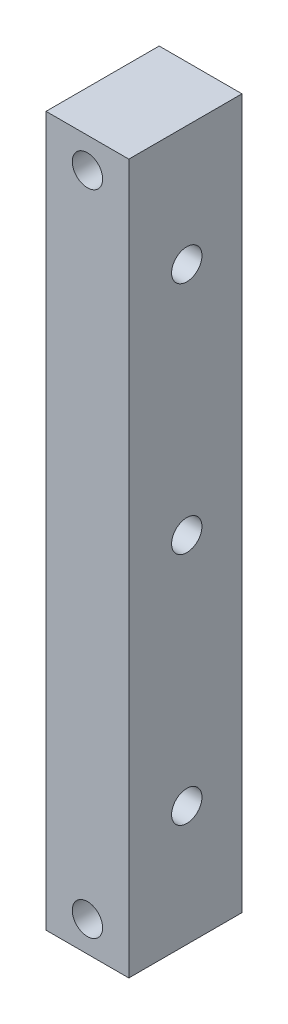
ISO-10303-21;
HEADER;
FILE_DESCRIPTION(('STEP AP214'),'2;1');
FILE_NAME('part.step','',(''),(''),'','','');
FILE_SCHEMA(('AUTOMOTIVE_DESIGN { 1 0 10303 214 1 1 1 1 }'));
ENDSEC;
DATA;
#1=APPLICATION_CONTEXT('core data for automotive mechanical design processes');
#2=APPLICATION_PROTOCOL_DEFINITION('international standard','automotive_design',2000,#1);
#3=PRODUCT_CONTEXT('',#1,'mechanical');
#4=PRODUCT('Part','Part','',(#3));
#5=PRODUCT_RELATED_PRODUCT_CATEGORY('part','',(#4));
#6=PRODUCT_DEFINITION_FORMATION('','',#4);
#7=PRODUCT_DEFINITION_CONTEXT('part definition',#1,'design');
#8=PRODUCT_DEFINITION('design','',#6,#7);
#9=PRODUCT_DEFINITION_SHAPE('','',#8);
#10=(LENGTH_UNIT() NAMED_UNIT(*) SI_UNIT(.MILLI.,.METRE.));
#11=(NAMED_UNIT(*) PLANE_ANGLE_UNIT() SI_UNIT($,.RADIAN.));
#12=(NAMED_UNIT(*) SI_UNIT($,.STERADIAN.) SOLID_ANGLE_UNIT());
#13=UNCERTAINTY_MEASURE_WITH_UNIT(LENGTH_MEASURE(1.E-05),#10,'distance_accuracy_value','');
#14=(GEOMETRIC_REPRESENTATION_CONTEXT(3) GLOBAL_UNCERTAINTY_ASSIGNED_CONTEXT((#13)) GLOBAL_UNIT_ASSIGNED_CONTEXT((#10,
#11,#12)) REPRESENTATION_CONTEXT('',''));
#15=CARTESIAN_POINT('',(0.,0.,0.));
#16=DIRECTION('',(0.,0.,1.));
#17=DIRECTION('',(1.,0.,0.));
#18=AXIS2_PLACEMENT_3D('',#15,#16,#17);
#19=CARTESIAN_POINT('',(-66.2916512459885,-3.3,19.2));
#20=DIRECTION('',(1.,0.,0.));
#21=DIRECTION('',(0.,0.,-1.));
#22=AXIS2_PLACEMENT_3D('',#19,#20,#21);
#23=PLANE('',#22);
#24=CARTESIAN_POINT('',(-66.2916512459885,-46.,15.));
#25=DIRECTION('',(1.,0.,0.));
#26=DIRECTION('',(0.,0.,-1.));
#27=AXIS2_PLACEMENT_3D('',#24,#25,#26);
#28=CIRCLE('',#27,2.05);
#29=CARTESIAN_POINT('',(-66.2916512459885,-46.,12.95));
#30=VERTEX_POINT('',#29);
#31=EDGE_CURVE('E137',#30,#30,#28,.F.);
#32=ORIENTED_EDGE('',*,*,#31,.F.);
#33=EDGE_LOOP('',(#32));
#34=FACE_BOUND('',#33,.T.);
#35=CARTESIAN_POINT('',(-66.2916512459885,-29.,15.));
#36=DIRECTION('',(1.,0.,0.));
#37=DIRECTION('',(0.,0.,-1.));
#38=AXIS2_PLACEMENT_3D('',#35,#36,#37);
#39=CIRCLE('',#38,2.05);
#40=CARTESIAN_POINT('',(-66.2916512459885,-29.,12.95));
#41=VERTEX_POINT('',#40);
#42=EDGE_CURVE('E130',#41,#41,#39,.F.);
#43=ORIENTED_EDGE('',*,*,#42,.F.);
#44=EDGE_LOOP('',(#43));
#45=FACE_BOUND('',#44,.T.);
#46=CARTESIAN_POINT('',(-66.2916512459885,-12.,15.));
#47=DIRECTION('',(1.,0.,0.));
#48=DIRECTION('',(0.,0.,-1.));
#49=AXIS2_PLACEMENT_3D('',#46,#47,#48);
#50=CIRCLE('',#49,2.05);
#51=CARTESIAN_POINT('',(-66.2916512459885,-12.,12.95));
#52=VERTEX_POINT('',#51);
#53=EDGE_CURVE('E117',#52,#52,#50,.F.);
#54=ORIENTED_EDGE('',*,*,#53,.F.);
#55=EDGE_LOOP('',(#54));
#56=FACE_BOUND('',#55,.T.);
#57=DIRECTION('',(0.,-1.,0.));
#58=VECTOR('',#57,1.);
#59=CARTESIAN_POINT('',(-66.2916512459885,-3.3,11.));
#60=LINE('',#59,#58);
#61=CARTESIAN_POINT('',(-66.2916512459885,-3.3,11.));
#62=VERTEX_POINT('',#61);
#63=CARTESIAN_POINT('',(-66.2916512459885,-54.7,11.));
#64=VERTEX_POINT('',#63);
#65=EDGE_CURVE('E110',#62,#64,#60,.T.);
#66=ORIENTED_EDGE('',*,*,#65,.T.);
#67=DIRECTION('',(0.,0.,-1.));
#68=VECTOR('',#67,1.);
#69=CARTESIAN_POINT('',(-66.2916512459885,-54.7,19.2));
#70=LINE('',#69,#68);
#71=CARTESIAN_POINT('',(-66.2916512459885,-54.7,19.2));
#72=VERTEX_POINT('',#71);
#73=EDGE_CURVE('E11',#72,#64,#70,.T.);
#74=ORIENTED_EDGE('',*,*,#73,.F.);
#75=DIRECTION('',(0.,-1.,0.));
#76=VECTOR('',#75,1.);
#77=CARTESIAN_POINT('',(-66.2916512459885,-3.3,19.2));
#78=LINE('',#77,#76);
#79=CARTESIAN_POINT('',(-66.2916512459885,-3.3,19.2));
#80=VERTEX_POINT('',#79);
#81=EDGE_CURVE('E93',#80,#72,#78,.T.);
#82=ORIENTED_EDGE('',*,*,#81,.F.);
#83=DIRECTION('',(0.,0.,-1.));
#84=VECTOR('',#83,1.);
#85=CARTESIAN_POINT('',(-66.2916512459885,-3.3,19.2));
#86=LINE('',#85,#84);
#87=EDGE_CURVE('E101',#80,#62,#86,.T.);
#88=ORIENTED_EDGE('',*,*,#87,.T.);
#89=EDGE_LOOP('',(#66,#74,#82,#88));
#90=FACE_BOUND('',#89,.T.);
#91=ADVANCED_FACE('F41',(#34,#45,#56,#90),#23,.F.);
#92=CARTESIAN_POINT('',(-66.2916512459885,-54.7,19.2));
#93=DIRECTION('',(0.,1.,0.));
#94=DIRECTION('',(0.,0.,1.));
#95=AXIS2_PLACEMENT_3D('',#92,#93,#94);
#96=PLANE('',#95);
#97=DIRECTION('',(1.,0.,0.));
#98=VECTOR('',#97,1.);
#99=CARTESIAN_POINT('',(-66.2916512459885,-54.7,11.));
#100=LINE('',#99,#98);
#101=CARTESIAN_POINT('',(-60.2916512459885,-54.7,11.));
#102=VERTEX_POINT('',#101);
#103=EDGE_CURVE('E96',#64,#102,#100,.T.);
#104=ORIENTED_EDGE('',*,*,#103,.T.);
#105=DIRECTION('',(0.,0.,-1.));
#106=VECTOR('',#105,1.);
#107=CARTESIAN_POINT('',(-60.2916512459885,-54.7,19.2));
#108=LINE('',#107,#106);
#109=CARTESIAN_POINT('',(-60.2916512459885,-54.7,19.2));
#110=VERTEX_POINT('',#109);
#111=EDGE_CURVE('E49',#110,#102,#108,.T.);
#112=ORIENTED_EDGE('',*,*,#111,.F.);
#113=DIRECTION('',(1.,0.,0.));
#114=VECTOR('',#113,1.);
#115=CARTESIAN_POINT('',(-66.2916512459885,-54.7,19.2));
#116=LINE('',#115,#114);
#117=EDGE_CURVE('E89',#72,#110,#116,.T.);
#118=ORIENTED_EDGE('',*,*,#117,.F.);
#119=ORIENTED_EDGE('',*,*,#73,.T.);
#120=EDGE_LOOP('',(#104,#112,#118,#119));
#121=FACE_BOUND('',#120,.T.);
#122=ADVANCED_FACE('F97',(#121),#96,.F.);
#123=CARTESIAN_POINT('',(-60.2916512459885,-54.7,19.2));
#124=DIRECTION('',(-1.,0.,0.));
#125=DIRECTION('',(0.,0.,1.));
#126=AXIS2_PLACEMENT_3D('',#123,#124,#125);
#127=PLANE('',#126);
#128=CARTESIAN_POINT('',(-60.2916512459885,-46.,15.));
#129=DIRECTION('',(-1.,0.,0.));
#130=DIRECTION('',(0.,0.,1.));
#131=AXIS2_PLACEMENT_3D('',#128,#129,#130);
#132=CIRCLE('',#131,1.1);
#133=CARTESIAN_POINT('',(-60.2916512459885,-46.,16.1));
#134=VERTEX_POINT('',#133);
#135=EDGE_CURVE('E132',#134,#134,#132,.F.);
#136=ORIENTED_EDGE('',*,*,#135,.F.);
#137=EDGE_LOOP('',(#136));
#138=FACE_BOUND('',#137,.T.);
#139=CARTESIAN_POINT('',(-60.2916512459885,-29.,15.));
#140=DIRECTION('',(-1.,0.,0.));
#141=DIRECTION('',(0.,0.,1.));
#142=AXIS2_PLACEMENT_3D('',#139,#140,#141);
#143=CIRCLE('',#142,1.1);
#144=CARTESIAN_POINT('',(-60.2916512459885,-29.,16.1));
#145=VERTEX_POINT('',#144);
#146=EDGE_CURVE('E123',#145,#145,#143,.F.);
#147=ORIENTED_EDGE('',*,*,#146,.F.);
#148=EDGE_LOOP('',(#147));
#149=FACE_BOUND('',#148,.T.);
#150=CARTESIAN_POINT('',(-60.2916512459885,-12.,15.));
#151=DIRECTION('',(-1.,0.,0.));
#152=DIRECTION('',(0.,0.,1.));
#153=AXIS2_PLACEMENT_3D('',#150,#151,#152);
#154=CIRCLE('',#153,1.1);
#155=CARTESIAN_POINT('',(-60.2916512459885,-12.,16.1));
#156=VERTEX_POINT('',#155);
#157=EDGE_CURVE('E109',#156,#156,#154,.F.);
#158=ORIENTED_EDGE('',*,*,#157,.F.);
#159=EDGE_LOOP('',(#158));
#160=FACE_BOUND('',#159,.T.);
#161=DIRECTION('',(0.,1.,0.));
#162=VECTOR('',#161,1.);
#163=CARTESIAN_POINT('',(-60.2916512459885,-54.7,11.));
#164=LINE('',#163,#162);
#165=CARTESIAN_POINT('',(-60.2916512459885,-3.3,11.));
#166=VERTEX_POINT('',#165);
#167=EDGE_CURVE('E77',#102,#166,#164,.T.);
#168=ORIENTED_EDGE('',*,*,#167,.T.);
#169=DIRECTION('',(0.,0.,-1.));
#170=VECTOR('',#169,1.);
#171=CARTESIAN_POINT('',(-60.2916512459885,-3.3,19.2));
#172=LINE('',#171,#170);
#173=CARTESIAN_POINT('',(-60.2916512459885,-3.3,19.2));
#174=VERTEX_POINT('',#173);
#175=EDGE_CURVE('E100',#174,#166,#172,.T.);
#176=ORIENTED_EDGE('',*,*,#175,.F.);
#177=DIRECTION('',(0.,1.,0.));
#178=VECTOR('',#177,1.);
#179=CARTESIAN_POINT('',(-60.2916512459885,-54.7,19.2));
#180=LINE('',#179,#178);
#181=EDGE_CURVE('E95',#110,#174,#180,.T.);
#182=ORIENTED_EDGE('',*,*,#181,.F.);
#183=ORIENTED_EDGE('',*,*,#111,.T.);
#184=EDGE_LOOP('',(#168,#176,#182,#183));
#185=FACE_BOUND('',#184,.T.);
#186=ADVANCED_FACE('F103',(#138,#149,#160,#185),#127,.F.);
#187=CARTESIAN_POINT('',(-60.2916512459885,-3.3,19.2));
#188=DIRECTION('',(0.,-1.,0.));
#189=DIRECTION('',(0.,0.,-1.));
#190=AXIS2_PLACEMENT_3D('',#187,#188,#189);
#191=PLANE('',#190);
#192=DIRECTION('',(-1.,0.,0.));
#193=VECTOR('',#192,1.);
#194=CARTESIAN_POINT('',(-60.2916512459885,-3.3,11.));
#195=LINE('',#194,#193);
#196=EDGE_CURVE('E81',#166,#62,#195,.T.);
#197=ORIENTED_EDGE('',*,*,#196,.T.);
#198=ORIENTED_EDGE('',*,*,#87,.F.);
#199=DIRECTION('',(-1.,0.,0.));
#200=VECTOR('',#199,1.);
#201=CARTESIAN_POINT('',(-60.2916512459885,-3.3,19.2));
#202=LINE('',#201,#200);
#203=EDGE_CURVE('E56',#174,#80,#202,.T.);
#204=ORIENTED_EDGE('',*,*,#203,.F.);
#205=ORIENTED_EDGE('',*,*,#175,.T.);
#206=EDGE_LOOP('',(#197,#198,#204,#205));
#207=FACE_BOUND('',#206,.T.);
#208=ADVANCED_FACE('F206',(#207),#191,.F.);
#209=CARTESIAN_POINT('',(0.,0.,19.2));
#210=DIRECTION('',(0.,0.,1.));
#211=DIRECTION('',(1.,0.,0.));
#212=AXIS2_PLACEMENT_3D('',#209,#210,#211);
#213=PLANE('',#212);
#214=CARTESIAN_POINT('',(-63.2916512459885,-52.5,19.2));
#215=DIRECTION('',(0.,0.,1.));
#216=DIRECTION('',(1.,0.,0.));
#217=AXIS2_PLACEMENT_3D('',#214,#215,#216);
#218=CIRCLE('',#217,1.1);
#219=CARTESIAN_POINT('',(-62.1916512459885,-52.5,19.2));
#220=VERTEX_POINT('',#219);
#221=EDGE_CURVE('E146',#220,#220,#218,.F.);
#222=ORIENTED_EDGE('',*,*,#221,.T.);
#223=EDGE_LOOP('',(#222));
#224=FACE_BOUND('',#223,.T.);
#225=CARTESIAN_POINT('',(-63.2916512459885,-5.5,19.2));
#226=DIRECTION('',(0.,0.,1.));
#227=DIRECTION('',(1.,0.,0.));
#228=AXIS2_PLACEMENT_3D('',#225,#226,#227);
#229=CIRCLE('',#228,1.1);
#230=CARTESIAN_POINT('',(-62.1916512459885,-5.5,19.2));
#231=VERTEX_POINT('',#230);
#232=EDGE_CURVE('E149',#231,#231,#229,.F.);
#233=ORIENTED_EDGE('',*,*,#232,.T.);
#234=EDGE_LOOP('',(#233));
#235=FACE_BOUND('',#234,.T.);
#236=ORIENTED_EDGE('',*,*,#81,.T.);
#237=ORIENTED_EDGE('',*,*,#117,.T.);
#238=ORIENTED_EDGE('',*,*,#181,.T.);
#239=ORIENTED_EDGE('',*,*,#203,.T.);
#240=EDGE_LOOP('',(#236,#237,#238,#239));
#241=FACE_BOUND('',#240,.T.);
#242=ADVANCED_FACE('F87',(#224,#235,#241),#213,.T.);
#243=CARTESIAN_POINT('',(0.,0.,11.));
#244=DIRECTION('',(0.,0.,1.));
#245=DIRECTION('',(1.,0.,0.));
#246=AXIS2_PLACEMENT_3D('',#243,#244,#245);
#247=PLANE('',#246);
#248=CARTESIAN_POINT('',(-63.2916512459885,-52.5,11.));
#249=DIRECTION('',(0.,0.,1.));
#250=DIRECTION('',(1.,0.,0.));
#251=AXIS2_PLACEMENT_3D('',#248,#249,#250);
#252=CIRCLE('',#251,1.1);
#253=CARTESIAN_POINT('',(-62.1916512459885,-52.5,11.));
#254=VERTEX_POINT('',#253);
#255=EDGE_CURVE('E42',#254,#254,#252,.F.);
#256=ORIENTED_EDGE('',*,*,#255,.F.);
#257=EDGE_LOOP('',(#256));
#258=FACE_BOUND('',#257,.T.);
#259=CARTESIAN_POINT('',(-63.2916512459885,-5.5,11.));
#260=DIRECTION('',(0.,0.,1.));
#261=DIRECTION('',(1.,0.,0.));
#262=AXIS2_PLACEMENT_3D('',#259,#260,#261);
#263=CIRCLE('',#262,1.1);
#264=CARTESIAN_POINT('',(-62.1916512459885,-5.5,11.));
#265=VERTEX_POINT('',#264);
#266=EDGE_CURVE('E144',#265,#265,#263,.F.);
#267=ORIENTED_EDGE('',*,*,#266,.F.);
#268=EDGE_LOOP('',(#267));
#269=FACE_BOUND('',#268,.T.);
#270=ORIENTED_EDGE('',*,*,#65,.F.);
#271=ORIENTED_EDGE('',*,*,#196,.F.);
#272=ORIENTED_EDGE('',*,*,#167,.F.);
#273=ORIENTED_EDGE('',*,*,#103,.F.);
#274=EDGE_LOOP('',(#270,#271,#272,#273));
#275=FACE_BOUND('',#274,.T.);
#276=ADVANCED_FACE('F200',(#258,#269,#275),#247,.F.);
#277=CARTESIAN_POINT('',(-60.1916512459885,-12.,15.));
#278=DIRECTION('',(-1.,0.,0.));
#279=DIRECTION('',(0.,0.,1.));
#280=AXIS2_PLACEMENT_3D('',#277,#278,#279);
#281=CYLINDRICAL_SURFACE('',#280,1.1);
#282=CARTESIAN_POINT('',(-62.2916512459885,-12.,15.));
#283=DIRECTION('',(1.,0.,0.));
#284=DIRECTION('',(0.,0.,-1.));
#285=AXIS2_PLACEMENT_3D('',#282,#283,#284);
#286=CIRCLE('',#285,1.1);
#287=CARTESIAN_POINT('',(-62.2916512459885,-12.,13.9));
#288=VERTEX_POINT('',#287);
#289=EDGE_CURVE('E118',#288,#288,#286,.T.);
#290=ORIENTED_EDGE('',*,*,#289,.F.);
#291=EDGE_LOOP('',(#290));
#292=FACE_BOUND('',#291,.T.);
#293=ORIENTED_EDGE('',*,*,#157,.T.);
#294=EDGE_LOOP('',(#293));
#295=FACE_BOUND('',#294,.T.);
#296=ADVANCED_FACE('F179',(#292,#295),#281,.F.);
#297=CARTESIAN_POINT('',(-62.2916512459885,-12.,15.));
#298=DIRECTION('',(-1.,0.,0.));
#299=DIRECTION('',(0.,0.,1.));
#300=AXIS2_PLACEMENT_3D('',#297,#298,#299);
#301=CYLINDRICAL_SURFACE('',#300,2.05);
#302=CARTESIAN_POINT('',(-62.2916512459885,-12.,15.));
#303=DIRECTION('',(1.,0.,0.));
#304=DIRECTION('',(0.,0.,-1.));
#305=AXIS2_PLACEMENT_3D('',#302,#303,#304);
#306=CIRCLE('',#305,2.05);
#307=CARTESIAN_POINT('',(-62.2916512459885,-12.,12.95));
#308=VERTEX_POINT('',#307);
#309=EDGE_CURVE('E125',#308,#308,#306,.T.);
#310=ORIENTED_EDGE('',*,*,#309,.T.);
#311=EDGE_LOOP('',(#310));
#312=FACE_BOUND('',#311,.T.);
#313=ORIENTED_EDGE('',*,*,#53,.T.);
#314=EDGE_LOOP('',(#313));
#315=FACE_BOUND('',#314,.T.);
#316=ADVANCED_FACE('F164',(#312,#315),#301,.F.);
#317=CARTESIAN_POINT('',(-62.2916512459885,-12.,15.));
#318=DIRECTION('',(1.,0.,0.));
#319=DIRECTION('',(0.,0.,-1.));
#320=AXIS2_PLACEMENT_3D('',#317,#318,#319);
#321=PLANE('',#320);
#322=ORIENTED_EDGE('',*,*,#289,.T.);
#323=EDGE_LOOP('',(#322));
#324=FACE_BOUND('',#323,.T.);
#325=ORIENTED_EDGE('',*,*,#309,.F.);
#326=EDGE_LOOP('',(#325));
#327=FACE_BOUND('',#326,.T.);
#328=ADVANCED_FACE('F166',(#324,#327),#321,.F.);
#329=CARTESIAN_POINT('',(-60.1916512459885,-29.,15.));
#330=DIRECTION('',(-1.,0.,0.));
#331=DIRECTION('',(0.,0.,1.));
#332=AXIS2_PLACEMENT_3D('',#329,#330,#331);
#333=CYLINDRICAL_SURFACE('',#332,1.1);
#334=CARTESIAN_POINT('',(-62.2916512459885,-29.,15.));
#335=DIRECTION('',(1.,0.,0.));
#336=DIRECTION('',(0.,0.,-1.));
#337=AXIS2_PLACEMENT_3D('',#334,#335,#336);
#338=CIRCLE('',#337,1.1);
#339=CARTESIAN_POINT('',(-62.2916512459885,-29.,13.9));
#340=VERTEX_POINT('',#339);
#341=EDGE_CURVE('E128',#340,#340,#338,.T.);
#342=ORIENTED_EDGE('',*,*,#341,.F.);
#343=EDGE_LOOP('',(#342));
#344=FACE_BOUND('',#343,.T.);
#345=ORIENTED_EDGE('',*,*,#146,.T.);
#346=EDGE_LOOP('',(#345));
#347=FACE_BOUND('',#346,.T.);
#348=ADVANCED_FACE('F167',(#344,#347),#333,.F.);
#349=CARTESIAN_POINT('',(-62.2916512459885,-29.,15.));
#350=DIRECTION('',(-1.,0.,0.));
#351=DIRECTION('',(0.,0.,1.));
#352=AXIS2_PLACEMENT_3D('',#349,#350,#351);
#353=CYLINDRICAL_SURFACE('',#352,2.05);
#354=CARTESIAN_POINT('',(-62.2916512459885,-29.,15.));
#355=DIRECTION('',(1.,0.,0.));
#356=DIRECTION('',(0.,0.,-1.));
#357=AXIS2_PLACEMENT_3D('',#354,#355,#356);
#358=CIRCLE('',#357,2.05);
#359=CARTESIAN_POINT('',(-62.2916512459885,-29.,12.95));
#360=VERTEX_POINT('',#359);
#361=EDGE_CURVE('E135',#360,#360,#358,.T.);
#362=ORIENTED_EDGE('',*,*,#361,.T.);
#363=EDGE_LOOP('',(#362));
#364=FACE_BOUND('',#363,.T.);
#365=ORIENTED_EDGE('',*,*,#42,.T.);
#366=EDGE_LOOP('',(#365));
#367=FACE_BOUND('',#366,.T.);
#368=ADVANCED_FACE('F180',(#364,#367),#353,.F.);
#369=CARTESIAN_POINT('',(-62.2916512459885,-29.,15.));
#370=DIRECTION('',(1.,0.,0.));
#371=DIRECTION('',(0.,0.,-1.));
#372=AXIS2_PLACEMENT_3D('',#369,#370,#371);
#373=PLANE('',#372);
#374=ORIENTED_EDGE('',*,*,#341,.T.);
#375=EDGE_LOOP('',(#374));
#376=FACE_BOUND('',#375,.T.);
#377=ORIENTED_EDGE('',*,*,#361,.F.);
#378=EDGE_LOOP('',(#377));
#379=FACE_BOUND('',#378,.T.);
#380=ADVANCED_FACE('F230',(#376,#379),#373,.F.);
#381=CARTESIAN_POINT('',(-60.1916512459885,-46.,15.));
#382=DIRECTION('',(-1.,0.,0.));
#383=DIRECTION('',(0.,0.,1.));
#384=AXIS2_PLACEMENT_3D('',#381,#382,#383);
#385=CYLINDRICAL_SURFACE('',#384,1.1);
#386=CARTESIAN_POINT('',(-62.2916512459885,-46.,15.));
#387=DIRECTION('',(1.,0.,0.));
#388=DIRECTION('',(0.,0.,-1.));
#389=AXIS2_PLACEMENT_3D('',#386,#387,#388);
#390=CIRCLE('',#389,1.1);
#391=CARTESIAN_POINT('',(-62.2916512459885,-46.,13.9));
#392=VERTEX_POINT('',#391);
#393=EDGE_CURVE('E138',#392,#392,#390,.T.);
#394=ORIENTED_EDGE('',*,*,#393,.F.);
#395=EDGE_LOOP('',(#394));
#396=FACE_BOUND('',#395,.T.);
#397=ORIENTED_EDGE('',*,*,#135,.T.);
#398=EDGE_LOOP('',(#397));
#399=FACE_BOUND('',#398,.T.);
#400=ADVANCED_FACE('F227',(#396,#399),#385,.F.);
#401=CARTESIAN_POINT('',(-62.2916512459885,-46.,15.));
#402=DIRECTION('',(-1.,0.,0.));
#403=DIRECTION('',(0.,0.,1.));
#404=AXIS2_PLACEMENT_3D('',#401,#402,#403);
#405=CYLINDRICAL_SURFACE('',#404,2.05);
#406=CARTESIAN_POINT('',(-62.2916512459885,-46.,15.));
#407=DIRECTION('',(1.,0.,0.));
#408=DIRECTION('',(0.,0.,-1.));
#409=AXIS2_PLACEMENT_3D('',#406,#407,#408);
#410=CIRCLE('',#409,2.05);
#411=CARTESIAN_POINT('',(-62.2916512459885,-46.,12.95));
#412=VERTEX_POINT('',#411);
#413=EDGE_CURVE('E145',#412,#412,#410,.T.);
#414=ORIENTED_EDGE('',*,*,#413,.T.);
#415=EDGE_LOOP('',(#414));
#416=FACE_BOUND('',#415,.T.);
#417=ORIENTED_EDGE('',*,*,#31,.T.);
#418=EDGE_LOOP('',(#417));
#419=FACE_BOUND('',#418,.T.);
#420=ADVANCED_FACE('F226',(#416,#419),#405,.F.);
#421=CARTESIAN_POINT('',(-62.2916512459885,-46.,15.));
#422=DIRECTION('',(1.,0.,0.));
#423=DIRECTION('',(0.,0.,-1.));
#424=AXIS2_PLACEMENT_3D('',#421,#422,#423);
#425=PLANE('',#424);
#426=ORIENTED_EDGE('',*,*,#393,.T.);
#427=EDGE_LOOP('',(#426));
#428=FACE_BOUND('',#427,.T.);
#429=ORIENTED_EDGE('',*,*,#413,.F.);
#430=EDGE_LOOP('',(#429));
#431=FACE_BOUND('',#430,.T.);
#432=ADVANCED_FACE('F232',(#428,#431),#425,.F.);
#433=CARTESIAN_POINT('',(-63.2916512459885,-5.5,19.3));
#434=DIRECTION('',(0.,0.,-1.));
#435=DIRECTION('',(-1.,0.,0.));
#436=AXIS2_PLACEMENT_3D('',#433,#434,#435);
#437=CYLINDRICAL_SURFACE('',#436,1.1);
#438=ORIENTED_EDGE('',*,*,#232,.F.);
#439=EDGE_LOOP('',(#438));
#440=FACE_BOUND('',#439,.T.);
#441=ORIENTED_EDGE('',*,*,#266,.T.);
#442=EDGE_LOOP('',(#441));
#443=FACE_BOUND('',#442,.T.);
#444=ADVANCED_FACE('F276',(#440,#443),#437,.F.);
#445=CARTESIAN_POINT('',(-63.2916512459885,-52.5,19.3));
#446=DIRECTION('',(0.,0.,-1.));
#447=DIRECTION('',(-1.,0.,0.));
#448=AXIS2_PLACEMENT_3D('',#445,#446,#447);
#449=CYLINDRICAL_SURFACE('',#448,1.1);
#450=ORIENTED_EDGE('',*,*,#221,.F.);
#451=EDGE_LOOP('',(#450));
#452=FACE_BOUND('',#451,.T.);
#453=ORIENTED_EDGE('',*,*,#255,.T.);
#454=EDGE_LOOP('',(#453));
#455=FACE_BOUND('',#454,.T.);
#456=ADVANCED_FACE('F286',(#452,#455),#449,.F.);
#457=CLOSED_SHELL('',(#91,#122,#186,#208,#242,#276,#296,#316,#328,#348,#368,#380,#400,#420,#432,
#444,#456));
#458=MANIFOLD_SOLID_BREP('B2',#457);
#459=ADVANCED_BREP_SHAPE_REPRESENTATION('',(#18,#458),#14);
#460=SHAPE_DEFINITION_REPRESENTATION(#9,#459);
ENDSEC;
END-ISO-10303-21;
